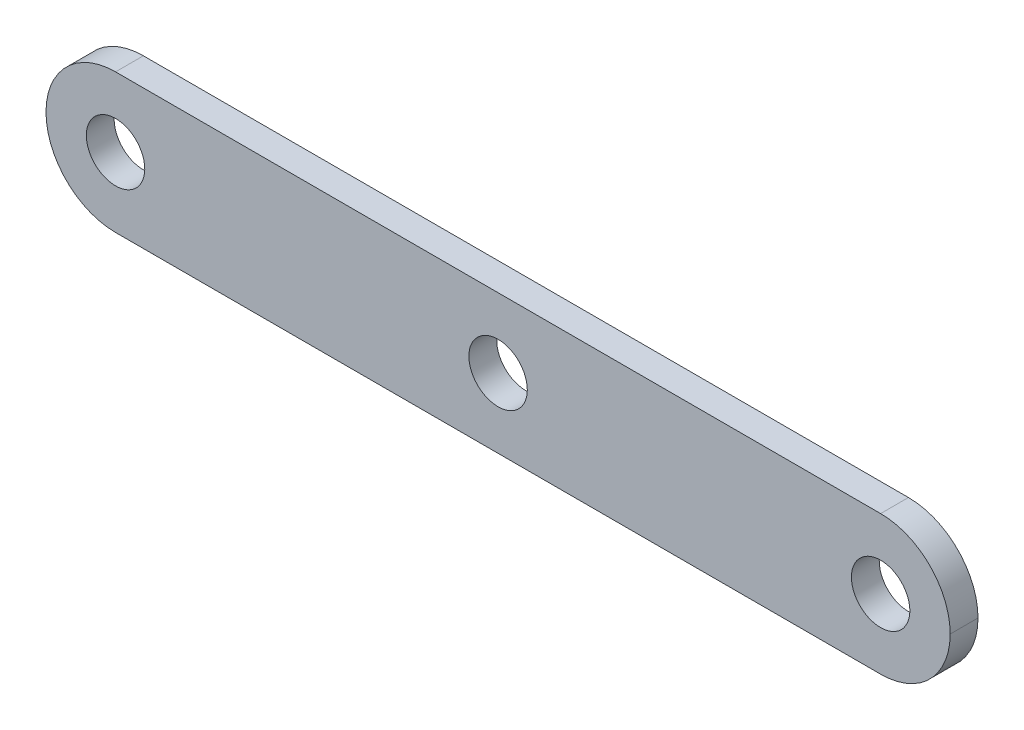
ISO-10303-21;
HEADER;
FILE_DESCRIPTION(('STEP AP214'),'2;1');
FILE_NAME('part.step','',(''),(''),'','','');
FILE_SCHEMA(('AUTOMOTIVE_DESIGN { 1 0 10303 214 1 1 1 1 }'));
ENDSEC;
DATA;
#1=APPLICATION_CONTEXT('core data for automotive mechanical design processes');
#2=APPLICATION_PROTOCOL_DEFINITION('international standard','automotive_design',2000,#1);
#3=PRODUCT_CONTEXT('',#1,'mechanical');
#4=PRODUCT('Part','Part','',(#3));
#5=PRODUCT_RELATED_PRODUCT_CATEGORY('part','',(#4));
#6=PRODUCT_DEFINITION_FORMATION('','',#4);
#7=PRODUCT_DEFINITION_CONTEXT('part definition',#1,'design');
#8=PRODUCT_DEFINITION('design','',#6,#7);
#9=PRODUCT_DEFINITION_SHAPE('','',#8);
#10=(LENGTH_UNIT() NAMED_UNIT(*) SI_UNIT(.MILLI.,.METRE.));
#11=(NAMED_UNIT(*) PLANE_ANGLE_UNIT() SI_UNIT($,.RADIAN.));
#12=(NAMED_UNIT(*) SI_UNIT($,.STERADIAN.) SOLID_ANGLE_UNIT());
#13=UNCERTAINTY_MEASURE_WITH_UNIT(LENGTH_MEASURE(1.E-05),#10,'distance_accuracy_value','');
#14=(GEOMETRIC_REPRESENTATION_CONTEXT(3) GLOBAL_UNCERTAINTY_ASSIGNED_CONTEXT((#13)) GLOBAL_UNIT_ASSIGNED_CONTEXT((#10,
#11,#12)) REPRESENTATION_CONTEXT('',''));
#15=CARTESIAN_POINT('',(0.,0.,0.));
#16=DIRECTION('',(0.,0.,1.));
#17=DIRECTION('',(1.,0.,0.));
#18=AXIS2_PLACEMENT_3D('',#15,#16,#17);
#19=CARTESIAN_POINT('',(-32.5,5.,-2.));
#20=DIRECTION('',(0.,-1.,0.));
#21=DIRECTION('',(0.,0.,1.));
#22=AXIS2_PLACEMENT_3D('',#19,#20,#21);
#23=PLANE('',#22);
#24=DIRECTION('',(-1.,0.,0.));
#25=VECTOR('',#24,1.);
#26=CARTESIAN_POINT('',(-32.5,5.,0.));
#27=LINE('',#26,#25);
#28=CARTESIAN_POINT('',(27.5,5.,0.));
#29=VERTEX_POINT('',#28);
#30=CARTESIAN_POINT('',(-27.5,5.,0.));
#31=VERTEX_POINT('',#30);
#32=EDGE_CURVE('E100',#29,#31,#27,.T.);
#33=ORIENTED_EDGE('',*,*,#32,.F.);
#34=DIRECTION('',(0.,0.,1.));
#35=VECTOR('',#34,1.);
#36=CARTESIAN_POINT('',(27.5,5.,-2.));
#37=LINE('',#36,#35);
#38=CARTESIAN_POINT('',(27.5,5.,-2.));
#39=VERTEX_POINT('',#38);
#40=EDGE_CURVE('E46',#39,#29,#37,.T.);
#41=ORIENTED_EDGE('',*,*,#40,.F.);
#42=DIRECTION('',(-1.,0.,0.));
#43=VECTOR('',#42,1.);
#44=CARTESIAN_POINT('',(-32.5,5.,-2.));
#45=LINE('',#44,#43);
#46=CARTESIAN_POINT('',(-27.5,5.,-2.));
#47=VERTEX_POINT('',#46);
#48=EDGE_CURVE('E138',#39,#47,#45,.T.);
#49=ORIENTED_EDGE('',*,*,#48,.T.);
#50=DIRECTION('',(0.,0.,1.));
#51=VECTOR('',#50,1.);
#52=CARTESIAN_POINT('',(-27.5,5.,-2.));
#53=LINE('',#52,#51);
#54=EDGE_CURVE('E11',#31,#47,#53,.F.);
#55=ORIENTED_EDGE('',*,*,#54,.F.);
#56=EDGE_LOOP('',(#33,#41,#49,#55));
#57=FACE_BOUND('',#56,.T.);
#58=ADVANCED_FACE('F37',(#57),#23,.F.);
#59=CARTESIAN_POINT('',(-32.5,-5.,-2.));
#60=DIRECTION('',(0.,1.,0.));
#61=DIRECTION('',(0.,0.,-1.));
#62=AXIS2_PLACEMENT_3D('',#59,#60,#61);
#63=PLANE('',#62);
#64=DIRECTION('',(1.,0.,0.));
#65=VECTOR('',#64,1.);
#66=CARTESIAN_POINT('',(-32.5,-5.,0.));
#67=LINE('',#66,#65);
#68=CARTESIAN_POINT('',(-27.5,-5.,0.));
#69=VERTEX_POINT('',#68);
#70=CARTESIAN_POINT('',(27.5,-5.,0.));
#71=VERTEX_POINT('',#70);
#72=EDGE_CURVE('E113',#69,#71,#67,.T.);
#73=ORIENTED_EDGE('',*,*,#72,.F.);
#74=DIRECTION('',(0.,0.,1.));
#75=VECTOR('',#74,1.);
#76=CARTESIAN_POINT('',(-27.5,-5.,-2.));
#77=LINE('',#76,#75);
#78=CARTESIAN_POINT('',(-27.5,-5.,-2.));
#79=VERTEX_POINT('',#78);
#80=EDGE_CURVE('E121',#79,#69,#77,.T.);
#81=ORIENTED_EDGE('',*,*,#80,.F.);
#82=DIRECTION('',(1.,0.,0.));
#83=VECTOR('',#82,1.);
#84=CARTESIAN_POINT('',(-32.5,-5.,-2.));
#85=LINE('',#84,#83);
#86=CARTESIAN_POINT('',(27.5,-5.,-2.));
#87=VERTEX_POINT('',#86);
#88=EDGE_CURVE('E108',#79,#87,#85,.T.);
#89=ORIENTED_EDGE('',*,*,#88,.T.);
#90=DIRECTION('',(0.,0.,1.));
#91=VECTOR('',#90,1.);
#92=CARTESIAN_POINT('',(27.5,-5.,-2.));
#93=LINE('',#92,#91);
#94=EDGE_CURVE('E124',#71,#87,#93,.F.);
#95=ORIENTED_EDGE('',*,*,#94,.F.);
#96=EDGE_LOOP('',(#73,#81,#89,#95));
#97=FACE_BOUND('',#96,.T.);
#98=ADVANCED_FACE('F140',(#97),#63,.F.);
#99=CARTESIAN_POINT('',(0.,0.,-2.));
#100=DIRECTION('',(0.,0.,1.));
#101=DIRECTION('',(-1.,0.,0.));
#102=AXIS2_PLACEMENT_3D('',#99,#100,#101);
#103=PLANE('',#102);
#104=CARTESIAN_POINT('',(27.5,0.,-2.));
#105=DIRECTION('',(0.,0.,1.));
#106=DIRECTION('',(-1.,0.,0.));
#107=AXIS2_PLACEMENT_3D('',#104,#105,#106);
#108=CIRCLE('',#107,2.1);
#109=CARTESIAN_POINT('',(25.4,0.,-2.));
#110=VERTEX_POINT('',#109);
#111=EDGE_CURVE('E158',#110,#110,#108,.T.);
#112=ORIENTED_EDGE('',*,*,#111,.T.);
#113=EDGE_LOOP('',(#112));
#114=FACE_BOUND('',#113,.T.);
#115=CARTESIAN_POINT('',(0.,0.,-2.));
#116=DIRECTION('',(0.,0.,1.));
#117=DIRECTION('',(1.,0.,0.));
#118=AXIS2_PLACEMENT_3D('',#115,#116,#117);
#119=CIRCLE('',#118,2.1);
#120=CARTESIAN_POINT('',(2.1,0.,-2.));
#121=VERTEX_POINT('',#120);
#122=EDGE_CURVE('E152',#121,#121,#119,.T.);
#123=ORIENTED_EDGE('',*,*,#122,.T.);
#124=EDGE_LOOP('',(#123));
#125=FACE_BOUND('',#124,.T.);
#126=CARTESIAN_POINT('',(-27.5,0.,-2.));
#127=DIRECTION('',(0.,0.,1.));
#128=DIRECTION('',(1.,0.,0.));
#129=AXIS2_PLACEMENT_3D('',#126,#127,#128);
#130=CIRCLE('',#129,2.1);
#131=CARTESIAN_POINT('',(-25.4,0.,-2.));
#132=VERTEX_POINT('',#131);
#133=EDGE_CURVE('E145',#132,#132,#130,.T.);
#134=ORIENTED_EDGE('',*,*,#133,.T.);
#135=EDGE_LOOP('',(#134));
#136=FACE_BOUND('',#135,.T.);
#137=CARTESIAN_POINT('',(-27.5,0.,-2.));
#138=DIRECTION('',(0.,0.,-1.));
#139=DIRECTION('',(-1.,0.,0.));
#140=AXIS2_PLACEMENT_3D('',#137,#138,#139);
#141=CIRCLE('',#140,5.);
#142=CARTESIAN_POINT('',(-32.5,0.,-2.));
#143=VERTEX_POINT('',#142);
#144=EDGE_CURVE('E60',#47,#143,#141,.F.);
#145=ORIENTED_EDGE('',*,*,#144,.F.);
#146=ORIENTED_EDGE('',*,*,#48,.F.);
#147=CARTESIAN_POINT('',(27.5,0.,-2.));
#148=DIRECTION('',(0.,0.,-1.));
#149=DIRECTION('',(-1.,0.,0.));
#150=AXIS2_PLACEMENT_3D('',#147,#148,#149);
#151=CIRCLE('',#150,5.);
#152=CARTESIAN_POINT('',(32.5,0.,-2.));
#153=VERTEX_POINT('',#152);
#154=EDGE_CURVE('E126',#153,#39,#151,.F.);
#155=ORIENTED_EDGE('',*,*,#154,.F.);
#156=CARTESIAN_POINT('',(27.5,0.,-2.));
#157=DIRECTION('',(0.,0.,-1.));
#158=DIRECTION('',(-1.,0.,0.));
#159=AXIS2_PLACEMENT_3D('',#156,#157,#158);
#160=CIRCLE('',#159,5.);
#161=EDGE_CURVE('E97',#87,#153,#160,.F.);
#162=ORIENTED_EDGE('',*,*,#161,.F.);
#163=ORIENTED_EDGE('',*,*,#88,.F.);
#164=CARTESIAN_POINT('',(-27.5,0.,-2.));
#165=DIRECTION('',(0.,0.,-1.));
#166=DIRECTION('',(-1.,0.,0.));
#167=AXIS2_PLACEMENT_3D('',#164,#165,#166);
#168=CIRCLE('',#167,5.);
#169=EDGE_CURVE('E130',#143,#79,#168,.F.);
#170=ORIENTED_EDGE('',*,*,#169,.F.);
#171=EDGE_LOOP('',(#145,#146,#155,#162,#163,#170));
#172=FACE_BOUND('',#171,.T.);
#173=ADVANCED_FACE('F136',(#114,#125,#136,#172),#103,.F.);
#174=CARTESIAN_POINT('',(0.,0.,0.));
#175=DIRECTION('',(0.,0.,1.));
#176=DIRECTION('',(-1.,0.,0.));
#177=AXIS2_PLACEMENT_3D('',#174,#175,#176);
#178=PLANE('',#177);
#179=CARTESIAN_POINT('',(27.5,0.,0.));
#180=DIRECTION('',(0.,0.,1.));
#181=DIRECTION('',(-1.,0.,0.));
#182=AXIS2_PLACEMENT_3D('',#179,#180,#181);
#183=CIRCLE('',#182,2.1);
#184=CARTESIAN_POINT('',(25.4,0.,0.));
#185=VERTEX_POINT('',#184);
#186=EDGE_CURVE('E149',#185,#185,#183,.T.);
#187=ORIENTED_EDGE('',*,*,#186,.F.);
#188=EDGE_LOOP('',(#187));
#189=FACE_BOUND('',#188,.T.);
#190=CARTESIAN_POINT('',(0.,0.,0.));
#191=DIRECTION('',(0.,0.,1.));
#192=DIRECTION('',(1.,0.,0.));
#193=AXIS2_PLACEMENT_3D('',#190,#191,#192);
#194=CIRCLE('',#193,2.1);
#195=CARTESIAN_POINT('',(2.1,0.,0.));
#196=VERTEX_POINT('',#195);
#197=EDGE_CURVE('E155',#196,#196,#194,.T.);
#198=ORIENTED_EDGE('',*,*,#197,.F.);
#199=EDGE_LOOP('',(#198));
#200=FACE_BOUND('',#199,.T.);
#201=CARTESIAN_POINT('',(-27.5,0.,0.));
#202=DIRECTION('',(0.,0.,1.));
#203=DIRECTION('',(1.,0.,0.));
#204=AXIS2_PLACEMENT_3D('',#201,#202,#203);
#205=CIRCLE('',#204,2.1);
#206=CARTESIAN_POINT('',(-25.4,0.,0.));
#207=VERTEX_POINT('',#206);
#208=EDGE_CURVE('E148',#207,#207,#205,.T.);
#209=ORIENTED_EDGE('',*,*,#208,.F.);
#210=EDGE_LOOP('',(#209));
#211=FACE_BOUND('',#210,.T.);
#212=ORIENTED_EDGE('',*,*,#72,.T.);
#213=CARTESIAN_POINT('',(27.5,0.,0.));
#214=DIRECTION('',(0.,0.,-1.));
#215=DIRECTION('',(-1.,0.,0.));
#216=AXIS2_PLACEMENT_3D('',#213,#214,#215);
#217=CIRCLE('',#216,5.);
#218=CARTESIAN_POINT('',(32.5,0.,0.));
#219=VERTEX_POINT('',#218);
#220=EDGE_CURVE('E95',#219,#71,#217,.T.);
#221=ORIENTED_EDGE('',*,*,#220,.F.);
#222=CARTESIAN_POINT('',(27.5,0.,0.));
#223=DIRECTION('',(0.,0.,-1.));
#224=DIRECTION('',(-1.,0.,0.));
#225=AXIS2_PLACEMENT_3D('',#222,#223,#224);
#226=CIRCLE('',#225,5.);
#227=EDGE_CURVE('E102',#29,#219,#226,.T.);
#228=ORIENTED_EDGE('',*,*,#227,.F.);
#229=ORIENTED_EDGE('',*,*,#32,.T.);
#230=CARTESIAN_POINT('',(-27.5,0.,0.));
#231=DIRECTION('',(0.,0.,-1.));
#232=DIRECTION('',(-1.,0.,0.));
#233=AXIS2_PLACEMENT_3D('',#230,#231,#232);
#234=CIRCLE('',#233,5.);
#235=CARTESIAN_POINT('',(-32.5,0.,0.));
#236=VERTEX_POINT('',#235);
#237=EDGE_CURVE('E114',#236,#31,#234,.T.);
#238=ORIENTED_EDGE('',*,*,#237,.F.);
#239=CARTESIAN_POINT('',(-27.5,0.,0.));
#240=DIRECTION('',(0.,0.,-1.));
#241=DIRECTION('',(-1.,0.,0.));
#242=AXIS2_PLACEMENT_3D('',#239,#240,#241);
#243=CIRCLE('',#242,5.);
#244=EDGE_CURVE('E116',#69,#236,#243,.T.);
#245=ORIENTED_EDGE('',*,*,#244,.F.);
#246=EDGE_LOOP('',(#212,#221,#228,#229,#238,#245));
#247=FACE_BOUND('',#246,.T.);
#248=ADVANCED_FACE('F111',(#189,#200,#211,#247),#178,.T.);
#249=CARTESIAN_POINT('',(27.5,0.,-2.));
#250=DIRECTION('',(0.,0.,1.));
#251=DIRECTION('',(-1.,0.,0.));
#252=AXIS2_PLACEMENT_3D('',#249,#250,#251);
#253=CYLINDRICAL_SURFACE('',#252,5.);
#254=ORIENTED_EDGE('',*,*,#40,.T.);
#255=ORIENTED_EDGE('',*,*,#227,.T.);
#256=DIRECTION('',(0.,0.,1.));
#257=VECTOR('',#256,1.);
#258=CARTESIAN_POINT('',(32.5,0.,-2.));
#259=LINE('',#258,#257);
#260=EDGE_CURVE('E90',#219,#153,#259,.F.);
#261=ORIENTED_EDGE('',*,*,#260,.T.);
#262=ORIENTED_EDGE('',*,*,#154,.T.);
#263=EDGE_LOOP('',(#254,#255,#261,#262));
#264=FACE_BOUND('',#263,.T.);
#265=ADVANCED_FACE('F103',(#264),#253,.T.);
#266=CARTESIAN_POINT('',(27.5,0.,-2.));
#267=DIRECTION('',(0.,0.,1.));
#268=DIRECTION('',(-1.,0.,0.));
#269=AXIS2_PLACEMENT_3D('',#266,#267,#268);
#270=CYLINDRICAL_SURFACE('',#269,5.);
#271=ORIENTED_EDGE('',*,*,#161,.T.);
#272=ORIENTED_EDGE('',*,*,#260,.F.);
#273=ORIENTED_EDGE('',*,*,#220,.T.);
#274=ORIENTED_EDGE('',*,*,#94,.T.);
#275=EDGE_LOOP('',(#271,#272,#273,#274));
#276=FACE_BOUND('',#275,.T.);
#277=ADVANCED_FACE('F92',(#276),#270,.T.);
#278=CARTESIAN_POINT('',(-27.5,0.,-2.));
#279=DIRECTION('',(0.,0.,1.));
#280=DIRECTION('',(-1.,0.,0.));
#281=AXIS2_PLACEMENT_3D('',#278,#279,#280);
#282=CYLINDRICAL_SURFACE('',#281,5.);
#283=DIRECTION('',(0.,0.,1.));
#284=VECTOR('',#283,1.);
#285=CARTESIAN_POINT('',(-32.5,0.,-2.));
#286=LINE('',#285,#284);
#287=EDGE_CURVE('E41',#143,#236,#286,.T.);
#288=ORIENTED_EDGE('',*,*,#287,.T.);
#289=ORIENTED_EDGE('',*,*,#237,.T.);
#290=ORIENTED_EDGE('',*,*,#54,.T.);
#291=ORIENTED_EDGE('',*,*,#144,.T.);
#292=EDGE_LOOP('',(#288,#289,#290,#291));
#293=FACE_BOUND('',#292,.T.);
#294=ADVANCED_FACE('F39',(#293),#282,.T.);
#295=CARTESIAN_POINT('',(-27.5,0.,-2.));
#296=DIRECTION('',(0.,0.,1.));
#297=DIRECTION('',(-1.,0.,0.));
#298=AXIS2_PLACEMENT_3D('',#295,#296,#297);
#299=CYLINDRICAL_SURFACE('',#298,5.);
#300=ORIENTED_EDGE('',*,*,#169,.T.);
#301=ORIENTED_EDGE('',*,*,#80,.T.);
#302=ORIENTED_EDGE('',*,*,#244,.T.);
#303=ORIENTED_EDGE('',*,*,#287,.F.);
#304=EDGE_LOOP('',(#300,#301,#302,#303));
#305=FACE_BOUND('',#304,.T.);
#306=ADVANCED_FACE('F133',(#305),#299,.T.);
#307=CARTESIAN_POINT('',(-27.5,0.,0.));
#308=DIRECTION('',(0.,0.,-1.));
#309=DIRECTION('',(1.,0.,0.));
#310=AXIS2_PLACEMENT_3D('',#307,#308,#309);
#311=CYLINDRICAL_SURFACE('',#310,2.1);
#312=ORIENTED_EDGE('',*,*,#208,.T.);
#313=EDGE_LOOP('',(#312));
#314=FACE_BOUND('',#313,.T.);
#315=ORIENTED_EDGE('',*,*,#133,.F.);
#316=EDGE_LOOP('',(#315));
#317=FACE_BOUND('',#316,.T.);
#318=ADVANCED_FACE('F174',(#314,#317),#311,.F.);
#319=CARTESIAN_POINT('',(0.,0.,0.));
#320=DIRECTION('',(0.,0.,-1.));
#321=DIRECTION('',(1.,0.,0.));
#322=AXIS2_PLACEMENT_3D('',#319,#320,#321);
#323=CYLINDRICAL_SURFACE('',#322,2.1);
#324=ORIENTED_EDGE('',*,*,#197,.T.);
#325=EDGE_LOOP('',(#324));
#326=FACE_BOUND('',#325,.T.);
#327=ORIENTED_EDGE('',*,*,#122,.F.);
#328=EDGE_LOOP('',(#327));
#329=FACE_BOUND('',#328,.T.);
#330=ADVANCED_FACE('F177',(#326,#329),#323,.F.);
#331=CARTESIAN_POINT('',(27.5,0.,0.));
#332=DIRECTION('',(0.,0.,-1.));
#333=DIRECTION('',(1.,0.,0.));
#334=AXIS2_PLACEMENT_3D('',#331,#332,#333);
#335=CYLINDRICAL_SURFACE('',#334,2.1);
#336=ORIENTED_EDGE('',*,*,#186,.T.);
#337=EDGE_LOOP('',(#336));
#338=FACE_BOUND('',#337,.T.);
#339=ORIENTED_EDGE('',*,*,#111,.F.);
#340=EDGE_LOOP('',(#339));
#341=FACE_BOUND('',#340,.T.);
#342=ADVANCED_FACE('F164',(#338,#341),#335,.F.);
#343=CLOSED_SHELL('',(#58,#98,#173,#248,#265,#277,#294,#306,#318,#330,#342));
#344=MANIFOLD_SOLID_BREP('B2',#343);
#345=ADVANCED_BREP_SHAPE_REPRESENTATION('',(#18,#344),#14);
#346=SHAPE_DEFINITION_REPRESENTATION(#9,#345);
ENDSEC;
END-ISO-10303-21;
